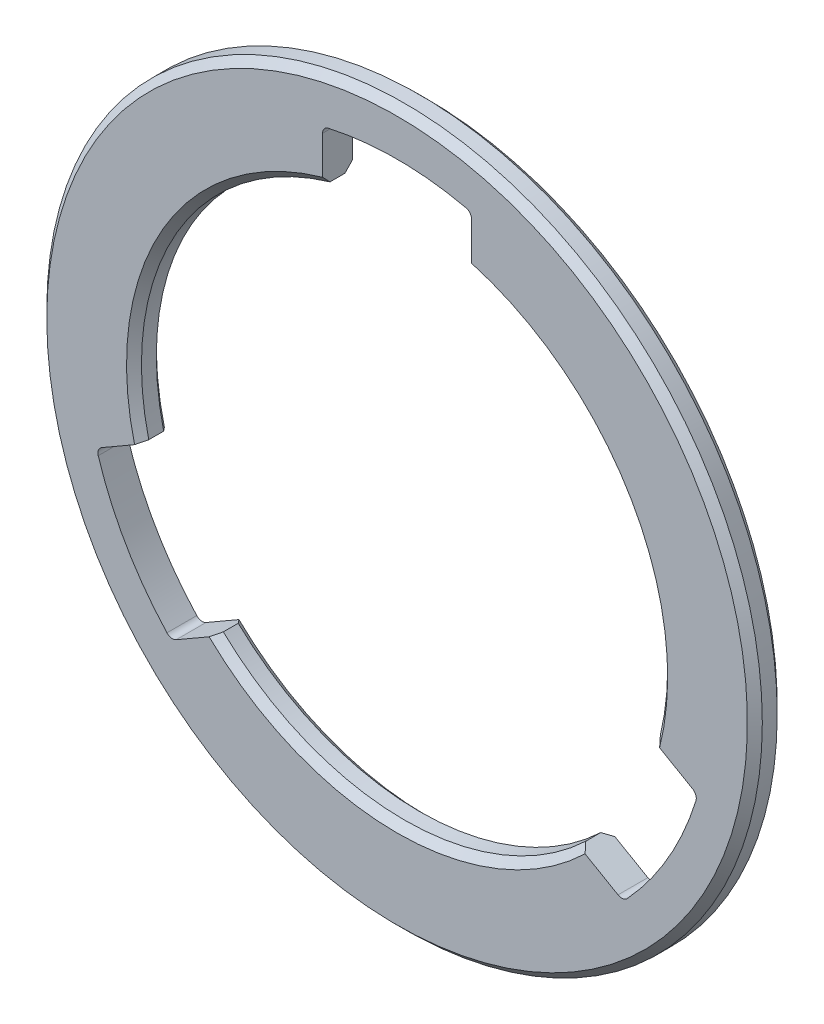
ISO-10303-21;
HEADER;
FILE_DESCRIPTION(('STEP AP214'),'2;1');
FILE_NAME('part.step','',(''),(''),'','','');
FILE_SCHEMA(('AUTOMOTIVE_DESIGN { 1 0 10303 214 1 1 1 1 }'));
ENDSEC;
DATA;
#1=APPLICATION_CONTEXT('core data for automotive mechanical design processes');
#2=APPLICATION_PROTOCOL_DEFINITION('international standard','automotive_design',2000,#1);
#3=PRODUCT_CONTEXT('',#1,'mechanical');
#4=PRODUCT('Part','Part','',(#3));
#5=PRODUCT_RELATED_PRODUCT_CATEGORY('part','',(#4));
#6=PRODUCT_DEFINITION_FORMATION('','',#4);
#7=PRODUCT_DEFINITION_CONTEXT('part definition',#1,'design');
#8=PRODUCT_DEFINITION('design','',#6,#7);
#9=PRODUCT_DEFINITION_SHAPE('','',#8);
#10=(LENGTH_UNIT() NAMED_UNIT(*) SI_UNIT(.MILLI.,.METRE.));
#11=(NAMED_UNIT(*) PLANE_ANGLE_UNIT() SI_UNIT($,.RADIAN.));
#12=(NAMED_UNIT(*) SI_UNIT($,.STERADIAN.) SOLID_ANGLE_UNIT());
#13=UNCERTAINTY_MEASURE_WITH_UNIT(LENGTH_MEASURE(1.E-05),#10,'distance_accuracy_value','');
#14=(GEOMETRIC_REPRESENTATION_CONTEXT(3) GLOBAL_UNCERTAINTY_ASSIGNED_CONTEXT((#13)) GLOBAL_UNIT_ASSIGNED_CONTEXT((#10,
#11,#12)) REPRESENTATION_CONTEXT('',''));
#15=CARTESIAN_POINT('',(0.,0.,0.));
#16=DIRECTION('',(0.,0.,1.));
#17=DIRECTION('',(1.,0.,0.));
#18=AXIS2_PLACEMENT_3D('',#15,#16,#17);
#19=CARTESIAN_POINT('',(0.,0.,2.));
#20=DIRECTION('',(0.,0.,-1.));
#21=DIRECTION('',(-1.,0.,0.));
#22=AXIS2_PLACEMENT_3D('',#19,#20,#21);
#23=CYLINDRICAL_SURFACE('',#22,17.65);
#24=CARTESIAN_POINT('',(0.,0.,1.5));
#25=DIRECTION('',(0.,0.,-1.));
#26=DIRECTION('',(-1.,0.,0.));
#27=AXIS2_PLACEMENT_3D('',#24,#25,#26);
#28=CIRCLE('',#27,17.65);
#29=CARTESIAN_POINT('',(-12.1591908030424,-12.7936147751606,1.5));
#30=VERTEX_POINT('',#29);
#31=CARTESIAN_POINT('',(12.1591908030423,-12.7936147751608,1.5));
#32=VERTEX_POINT('',#31);
#33=EDGE_CURVE('E283',#30,#32,#28,.F.);
#34=ORIENTED_EDGE('',*,*,#33,.T.);
#35=DIRECTION('',(0.,0.,-1.));
#36=VECTOR('',#35,1.);
#37=CARTESIAN_POINT('',(12.1591908030423,-12.7936147751608,2.));
#38=LINE('',#37,#36);
#39=CARTESIAN_POINT('',(12.1591908030423,-12.7936147751608,0.49999999999999));
#40=VERTEX_POINT('',#39);
#41=EDGE_CURVE('E487',#32,#40,#38,.T.);
#42=ORIENTED_EDGE('',*,*,#41,.T.);
#43=CARTESIAN_POINT('',(0.,0.,0.499999999999994));
#44=DIRECTION('',(0.,0.,-1.));
#45=DIRECTION('',(-1.,0.,0.));
#46=AXIS2_PLACEMENT_3D('',#43,#44,#45);
#47=CIRCLE('',#46,17.65);
#48=CARTESIAN_POINT('',(-12.1591908030424,-12.7936147751606,0.499999999999994));
#49=VERTEX_POINT('',#48);
#50=EDGE_CURVE('E293',#40,#49,#47,.T.);
#51=ORIENTED_EDGE('',*,*,#50,.T.);
#52=DIRECTION('',(0.,0.,-1.));
#53=VECTOR('',#52,1.);
#54=CARTESIAN_POINT('',(-12.1591908030424,-12.7936147751606,2.));
#55=LINE('',#54,#53);
#56=EDGE_CURVE('E241',#30,#49,#55,.T.);
#57=ORIENTED_EDGE('',*,*,#56,.F.);
#58=EDGE_LOOP('',(#34,#42,#51,#57));
#59=FACE_BOUND('',#58,.T.);
#60=ADVANCED_FACE('F50',(#59),#23,.F.);
#61=CARTESIAN_POINT('',(-5.,16.9269755124771,1.5));
#62=VERTEX_POINT('',#61);
#63=CARTESIAN_POINT('',(-17.1591908030423,-4.13336073731621,1.5));
#64=VERTEX_POINT('',#63);
#65=EDGE_CURVE('E285',#62,#64,#28,.F.);
#66=ORIENTED_EDGE('',*,*,#65,.T.);
#67=DIRECTION('',(0.,0.,-1.));
#68=VECTOR('',#67,1.);
#69=CARTESIAN_POINT('',(-17.1591908030423,-4.13336073731621,2.));
#70=LINE('',#69,#68);
#71=CARTESIAN_POINT('',(-17.1591908030423,-4.13336073731621,0.499999999999994));
#72=VERTEX_POINT('',#71);
#73=EDGE_CURVE('E248',#64,#72,#70,.T.);
#74=ORIENTED_EDGE('',*,*,#73,.T.);
#75=CARTESIAN_POINT('',(-5.,16.9269755124771,0.499999999999992));
#76=VERTEX_POINT('',#75);
#77=EDGE_CURVE('E288',#72,#76,#47,.T.);
#78=ORIENTED_EDGE('',*,*,#77,.T.);
#79=DIRECTION('',(0.,0.,-1.));
#80=VECTOR('',#79,1.);
#81=CARTESIAN_POINT('',(-5.,16.9269755124771,2.));
#82=LINE('',#81,#80);
#83=EDGE_CURVE('E335',#62,#76,#82,.T.);
#84=ORIENTED_EDGE('',*,*,#83,.F.);
#85=EDGE_LOOP('',(#66,#74,#78,#84));
#86=FACE_BOUND('',#85,.T.);
#87=ADVANCED_FACE('F434',(#86),#23,.F.);
#88=CARTESIAN_POINT('',(0.,0.,0.499999999999994));
#89=DIRECTION('',(0.,0.,-1.));
#90=DIRECTION('',(-1.,0.,0.));
#91=AXIS2_PLACEMENT_3D('',#88,#89,#90);
#92=CONICAL_SURFACE('',#91,17.65,0.785398163397448);
#93=CARTESIAN_POINT('',(12.6103381838395,-13.0540848369083,-0.000199999999999527));
#94=CARTESIAN_POINT('',(12.5351595462808,-13.0106804302765,0.0832513416940281));
#95=CARTESIAN_POINT('',(12.4599595621884,-12.9672636992177,0.166677012490159));
#96=CARTESIAN_POINT('',(12.3095169007529,-12.8804055881403,0.333477012490282));
#97=CARTESIAN_POINT('',(12.2342742234095,-12.8369642081215,0.416851341694148));
#98=CARTESIAN_POINT('',(12.1590101995325,-12.7935105036759,0.500199999999993));
#99=B_SPLINE_CURVE_WITH_KNOTS('',3,(#93,#94,#95,#96,#97,#98),.UNSPECIFIED.,.F.,.F.,(4,2,4),(0.,
0.361246500633454,0.722493002149039),.UNSPECIFIED.);
#100=CARTESIAN_POINT('',(12.6101580071155,-13.0539808118282,0.));
#101=VERTEX_POINT('',#100);
#102=EDGE_CURVE('E383',#101,#40,#99,.T.);
#103=ORIENTED_EDGE('',*,*,#102,.F.);
#104=CARTESIAN_POINT('',(0.,0.,0.));
#105=DIRECTION('',(0.,0.,-1.));
#106=DIRECTION('',(-1.,0.,0.));
#107=AXIS2_PLACEMENT_3D('',#104,#105,#106);
#108=CIRCLE('',#107,18.15);
#109=CARTESIAN_POINT('',(-12.6101580071157,-13.0539808118281,0.));
#110=VERTEX_POINT('',#109);
#111=EDGE_CURVE('E511',#110,#101,#108,.F.);
#112=ORIENTED_EDGE('',*,*,#111,.F.);
#113=CARTESIAN_POINT('',(-12.1590101995327,-12.7935105036757,0.500199999999992));
#114=CARTESIAN_POINT('',(-12.2342742234097,-12.8369642081214,0.416851341694149));
#115=CARTESIAN_POINT('',(-12.309516900753,-12.8804055881401,0.333477012490283));
#116=CARTESIAN_POINT('',(-12.4599595621886,-12.9672636992175,0.16667701249016));
#117=CARTESIAN_POINT('',(-12.5351595462809,-13.0106804302763,0.0832513416940287));
#118=CARTESIAN_POINT('',(-12.6103381838397,-13.0540848369081,-0.000199999999999895));
#119=B_SPLINE_CURVE_WITH_KNOTS('',3,(#113,#114,#115,#116,#117,#118),.UNSPECIFIED.,.F.,.F.,(4,2,
4),(0.,0.361246501515584,0.722493002149039),.UNSPECIFIED.);
#120=EDGE_CURVE('E362',#49,#110,#119,.T.);
#121=ORIENTED_EDGE('',*,*,#120,.F.);
#122=ORIENTED_EDGE('',*,*,#50,.F.);
#123=EDGE_LOOP('',(#103,#112,#121,#122));
#124=FACE_BOUND('',#123,.T.);
#125=ADVANCED_FACE('F352',(#124),#92,.F.);
#126=CARTESIAN_POINT('',(-17.6103381838396,-4.3938307990637,-0.000199999999999402));
#127=CARTESIAN_POINT('',(-17.5351595462809,-4.35042639243185,0.0832513416940282));
#128=CARTESIAN_POINT('',(-17.4599595621885,-4.30700966137309,0.166677012490159));
#129=CARTESIAN_POINT('',(-17.309516900753,-4.22015155029567,0.33347701249028));
#130=CARTESIAN_POINT('',(-17.2342742234096,-4.17671017027695,0.416851341694146));
#131=CARTESIAN_POINT('',(-17.1590101995326,-4.13325646583125,0.500199999999989));
#132=B_SPLINE_CURVE_WITH_KNOTS('',3,(#126,#127,#128,#129,#130,#131),.UNSPECIFIED.,.F.,.F.,(4,2,
4),(0.,0.361246500633452,0.722493002149036),.UNSPECIFIED.);
#133=CARTESIAN_POINT('',(-17.6101580071157,-4.39372677398362,0.));
#134=VERTEX_POINT('',#133);
#135=EDGE_CURVE('E370',#134,#72,#132,.T.);
#136=ORIENTED_EDGE('',*,*,#135,.F.);
#137=CARTESIAN_POINT('',(-5.,17.447707585812,0.));
#138=VERTEX_POINT('',#137);
#139=EDGE_CURVE('E529',#138,#134,#108,.F.);
#140=ORIENTED_EDGE('',*,*,#139,.F.);
#141=CARTESIAN_POINT('',(-5.,15.6054924629073,1.7630724353265));
#142=CARTESIAN_POINT('',(-5.,15.8742778879233,1.50709957923826));
#143=CARTESIAN_POINT('',(-5.,16.1427605947125,1.25080919893928));
#144=CARTESIAN_POINT('',(-5.,16.679190211907,0.737670071878489));
#145=CARTESIAN_POINT('',(-5.,16.9471371241062,0.480821326992185));
#146=CARTESIAN_POINT('',(-5.,17.4825663802371,-0.0333593598425538));
#147=CARTESIAN_POINT('',(-5.,17.7500487245398,-0.290691301404765));
#148=CARTESIAN_POINT('',(-5.,18.2846040684708,-0.805781819875646));
#149=CARTESIAN_POINT('',(-5.,18.551677066725,-1.06354039821038));
#150=CARTESIAN_POINT('',(-5.,18.8185720008104,-1.32148304956984));
#151=B_SPLINE_CURVE_WITH_KNOTS('',3,(#141,#142,#143,#144,#145,#146,#147,#148,#149,#150),
.UNSPECIFIED.,.F.,.F.,(4,2,2,2,4),(0.,1.11351157498704,2.22701941551088,3.34052636637302,
4.45403704676666),.UNSPECIFIED.);
#152=EDGE_CURVE('E325',#76,#138,#151,.T.);
#153=ORIENTED_EDGE('',*,*,#152,.F.);
#154=ORIENTED_EDGE('',*,*,#77,.F.);
#155=EDGE_LOOP('',(#136,#140,#153,#154));
#156=FACE_BOUND('',#155,.T.);
#157=ADVANCED_FACE('F353',(#156),#92,.F.);
#158=CARTESIAN_POINT('',(0.,0.,2.));
#159=DIRECTION('',(0.,0.,1.));
#160=DIRECTION('',(1.,0.,0.));
#161=AXIS2_PLACEMENT_3D('',#158,#159,#160);
#162=CONICAL_SURFACE('',#161,18.15,0.785398163397445);
#163=CARTESIAN_POINT('',(12.1590101995325,-12.7935105036759,1.4998));
#164=CARTESIAN_POINT('',(12.2342742234095,-12.8369642081215,1.58314865830584));
#165=CARTESIAN_POINT('',(12.3095169007529,-12.8804055881403,1.66652298750971));
#166=CARTESIAN_POINT('',(12.4599595621884,-12.9672636992177,1.83332298750984));
#167=CARTESIAN_POINT('',(12.5351595462808,-13.0106804302765,1.91674865830597));
#168=CARTESIAN_POINT('',(12.6103381838395,-13.0540848369083,2.0002));
#169=B_SPLINE_CURVE_WITH_KNOTS('',3,(#163,#164,#165,#166,#167,#168),.UNSPECIFIED.,.F.,.F.,(4,2,
4),(0.,0.361246501515592,0.722493002149054),.UNSPECIFIED.);
#170=CARTESIAN_POINT('',(12.6101580071156,-13.0539808118282,2.));
#171=VERTEX_POINT('',#170);
#172=EDGE_CURVE('E406',#32,#171,#169,.T.);
#173=ORIENTED_EDGE('',*,*,#172,.F.);
#174=ORIENTED_EDGE('',*,*,#33,.F.);
#175=CARTESIAN_POINT('',(-12.6103381838397,-13.0540848369081,2.0002));
#176=CARTESIAN_POINT('',(-12.535159546281,-13.0106804302763,1.91674865830597));
#177=CARTESIAN_POINT('',(-12.4599595621886,-12.9672636992175,1.83332298750984));
#178=CARTESIAN_POINT('',(-12.3095169007531,-12.8804055881401,1.66652298750971));
#179=CARTESIAN_POINT('',(-12.2342742234097,-12.8369642081214,1.58314865830584));
#180=CARTESIAN_POINT('',(-12.1590101995327,-12.7935105036757,1.4998));
#181=B_SPLINE_CURVE_WITH_KNOTS('',3,(#175,#176,#177,#178,#179,#180),.UNSPECIFIED.,.F.,.F.,(4,2,
4),(0.,0.36124650063346,0.722493002149052),.UNSPECIFIED.);
#182=CARTESIAN_POINT('',(-12.6101580071157,-13.0539808118281,2.));
#183=VERTEX_POINT('',#182);
#184=EDGE_CURVE('E253',#183,#30,#181,.T.);
#185=ORIENTED_EDGE('',*,*,#184,.F.);
#186=CARTESIAN_POINT('',(0.,0.,2.));
#187=DIRECTION('',(0.,0.,-1.));
#188=DIRECTION('',(-1.,0.,0.));
#189=AXIS2_PLACEMENT_3D('',#186,#187,#188);
#190=CIRCLE('',#189,18.15);
#191=EDGE_CURVE('E259',#171,#183,#190,.T.);
#192=ORIENTED_EDGE('',*,*,#191,.F.);
#193=EDGE_LOOP('',(#173,#174,#185,#192));
#194=FACE_BOUND('',#193,.T.);
#195=ADVANCED_FACE('F597',(#194),#162,.F.);
#196=CARTESIAN_POINT('',(-17.1590101995326,-4.13325646583125,1.49979999999999));
#197=CARTESIAN_POINT('',(-17.2342742234096,-4.17671017027695,1.58314865830584));
#198=CARTESIAN_POINT('',(-17.309516900753,-4.22015155029566,1.66652298750971));
#199=CARTESIAN_POINT('',(-17.4599595621885,-4.30700966137309,1.83332298750984));
#200=CARTESIAN_POINT('',(-17.5351595462809,-4.35042639243186,1.91674865830597));
#201=CARTESIAN_POINT('',(-17.6103381838396,-4.3938307990637,2.0002));
#202=B_SPLINE_CURVE_WITH_KNOTS('',3,(#196,#197,#198,#199,#200,#201),.UNSPECIFIED.,.F.,.F.,(4,2,
4),(0.,0.361246501515594,0.722493002149056),.UNSPECIFIED.);
#203=CARTESIAN_POINT('',(-17.6101580071157,-4.39372677398362,2.));
#204=VERTEX_POINT('',#203);
#205=EDGE_CURVE('E245',#64,#204,#202,.T.);
#206=ORIENTED_EDGE('',*,*,#205,.F.);
#207=ORIENTED_EDGE('',*,*,#65,.F.);
#208=CARTESIAN_POINT('',(-5.,18.8185720008104,3.32148304956985));
#209=CARTESIAN_POINT('',(-5.,18.551677066725,3.06354039821039));
#210=CARTESIAN_POINT('',(-5.,18.2846040684708,2.80578181987565));
#211=CARTESIAN_POINT('',(-5.,17.7500487245398,2.29069130140476));
#212=CARTESIAN_POINT('',(-5.,17.4825663802371,2.03335935984255));
#213=CARTESIAN_POINT('',(-5.,16.9471371241062,1.5191786730078));
#214=CARTESIAN_POINT('',(-5.,16.679190211907,1.26232992812149));
#215=CARTESIAN_POINT('',(-5.,16.1427605947125,0.749190801060692));
#216=CARTESIAN_POINT('',(-5.,15.8742778879232,0.492900420761712));
#217=CARTESIAN_POINT('',(-5.,15.6054924629073,0.236927564673468));
#218=B_SPLINE_CURVE_WITH_KNOTS('',3,(#208,#209,#210,#211,#212,#213,#214,#215,#216,#217),
.UNSPECIFIED.,.F.,.F.,(4,2,2,2,4),(0.,1.11351068039365,2.22701763125581,3.34052547177965,
4.4540370467667),.UNSPECIFIED.);
#219=CARTESIAN_POINT('',(-5.,17.447707585812,2.));
#220=VERTEX_POINT('',#219);
#221=EDGE_CURVE('E257',#220,#62,#218,.T.);
#222=ORIENTED_EDGE('',*,*,#221,.F.);
#223=EDGE_CURVE('E233',#204,#220,#190,.T.);
#224=ORIENTED_EDGE('',*,*,#223,.F.);
#225=EDGE_LOOP('',(#206,#207,#222,#224));
#226=FACE_BOUND('',#225,.T.);
#227=ADVANCED_FACE('F256',(#226),#162,.F.);
#228=CARTESIAN_POINT('',(0.,0.,2.));
#229=DIRECTION('',(0.,0.,-1.));
#230=DIRECTION('',(-1.,0.,0.));
#231=AXIS2_PLACEMENT_3D('',#228,#229,#230);
#232=CYLINDRICAL_SURFACE('',#231,24.);
#233=CARTESIAN_POINT('',(0.,0.,0.500000000000014));
#234=DIRECTION('',(0.,0.,-1.));
#235=DIRECTION('',(-1.,0.,0.));
#236=AXIS2_PLACEMENT_3D('',#233,#234,#235);
#237=CIRCLE('',#236,24.);
#238=CARTESIAN_POINT('',(-24.,0.,0.500000000000014));
#239=VERTEX_POINT('',#238);
#240=EDGE_CURVE('E260',#239,#239,#237,.F.);
#241=ORIENTED_EDGE('',*,*,#240,.T.);
#242=EDGE_LOOP('',(#241));
#243=FACE_BOUND('',#242,.T.);
#244=CARTESIAN_POINT('',(0.,0.,1.5));
#245=DIRECTION('',(0.,0.,-1.));
#246=DIRECTION('',(-1.,0.,0.));
#247=AXIS2_PLACEMENT_3D('',#244,#245,#246);
#248=CIRCLE('',#247,24.);
#249=CARTESIAN_POINT('',(-24.,0.,1.5));
#250=VERTEX_POINT('',#249);
#251=EDGE_CURVE('E268',#250,#250,#248,.T.);
#252=ORIENTED_EDGE('',*,*,#251,.T.);
#253=EDGE_LOOP('',(#252));
#254=FACE_BOUND('',#253,.T.);
#255=ADVANCED_FACE('F605',(#243,#254),#232,.T.);
#256=CARTESIAN_POINT('',(0.,0.,2.));
#257=DIRECTION('',(0.,0.,-1.));
#258=DIRECTION('',(-1.,0.,0.));
#259=AXIS2_PLACEMENT_3D('',#256,#257,#258);
#260=PLANE('',#259);
#261=CARTESIAN_POINT('',(0.,0.,2.));
#262=DIRECTION('',(0.,0.,-1.));
#263=DIRECTION('',(-1.,0.,0.));
#264=AXIS2_PLACEMENT_3D('',#261,#262,#263);
#265=CIRCLE('',#264,23.5);
#266=CARTESIAN_POINT('',(-23.5,0.,2.));
#267=VERTEX_POINT('',#266);
#268=EDGE_CURVE('E273',#267,#267,#265,.F.);
#269=ORIENTED_EDGE('',*,*,#268,.T.);
#270=EDGE_LOOP('',(#269));
#271=FACE_BOUND('',#270,.T.);
#272=DIRECTION('',(0.866025403784437,-0.500000000000003,0.));
#273=VECTOR('',#272,1.);
#274=CARTESIAN_POINT('',(20.1635217326557,-5.86791200826347,2.));
#275=LINE('',#274,#273);
#276=CARTESIAN_POINT('',(17.6101580071156,-4.39372677398387,2.));
#277=VERTEX_POINT('',#276);
#278=CARTESIAN_POINT('',(19.8205080756887,-5.6698729810779,2.));
#279=VERTEX_POINT('',#278);
#280=EDGE_CURVE('E486',#277,#279,#275,.T.);
#281=ORIENTED_EDGE('',*,*,#280,.T.);
#282=CARTESIAN_POINT('',(19.5705080756887,-6.10288568297011,2.));
#283=DIRECTION('',(0.,0.,-1.));
#284=DIRECTION('',(-1.,0.,0.));
#285=AXIS2_PLACEMENT_3D('',#282,#283,#284);
#286=CIRCLE('',#285,0.5);
#287=CARTESIAN_POINT('',(20.0478375409494,-6.25173655328646,2.));
#288=VERTEX_POINT('',#287);
#289=EDGE_CURVE('E813',#279,#288,#286,.T.);
#290=ORIENTED_EDGE('',*,*,#289,.T.);
#291=CARTESIAN_POINT('',(0.,0.,2.));
#292=DIRECTION('',(0.,0.,-1.));
#293=DIRECTION('',(0.500000000000004,0.866025403784436,0.));
#294=AXIS2_PLACEMENT_3D('',#291,#292,#293);
#295=CIRCLE('',#294,21.);
#296=CARTESIAN_POINT('',(15.4380814433884,-14.2360683247625,2.));
#297=VERTEX_POINT('',#296);
#298=EDGE_CURVE('E833',#288,#297,#295,.T.);
#299=ORIENTED_EDGE('',*,*,#298,.T.);
#300=CARTESIAN_POINT('',(15.0705080756887,-13.89711431703,2.));
#301=DIRECTION('',(0.,0.,-1.));
#302=DIRECTION('',(-1.,0.,0.));
#303=AXIS2_PLACEMENT_3D('',#300,#301,#302);
#304=CIRCLE('',#303,0.5);
#305=CARTESIAN_POINT('',(14.8205080756887,-14.3301270189223,2.));
#306=VERTEX_POINT('',#305);
#307=EDGE_CURVE('E817',#297,#306,#304,.T.);
#308=ORIENTED_EDGE('',*,*,#307,.T.);
#309=DIRECTION('',(-0.866025403784436,0.500000000000005,0.));
#310=VECTOR('',#309,1.);
#311=CARTESIAN_POINT('',(15.1635217326556,-14.5281660461078,2.));
#312=LINE('',#311,#310);
#313=EDGE_CURVE('E482',#306,#171,#312,.T.);
#314=ORIENTED_EDGE('',*,*,#313,.T.);
#315=ORIENTED_EDGE('',*,*,#191,.T.);
#316=DIRECTION('',(-0.866025403784443,-0.499999999999993,0.));
#317=VECTOR('',#316,1.);
#318=CARTESIAN_POINT('',(-15.1635217326558,-14.5281660461076,2.));
#319=LINE('',#318,#317);
#320=CARTESIAN_POINT('',(-14.8205080756889,-14.3301270189221,2.));
#321=VERTEX_POINT('',#320);
#322=EDGE_CURVE('E491',#183,#321,#319,.T.);
#323=ORIENTED_EDGE('',*,*,#322,.T.);
#324=CARTESIAN_POINT('',(-15.0705080756889,-13.8971143170298,2.));
#325=DIRECTION('',(0.,0.,-1.));
#326=DIRECTION('',(-1.,0.,0.));
#327=AXIS2_PLACEMENT_3D('',#324,#325,#326);
#328=CIRCLE('',#327,0.5);
#329=CARTESIAN_POINT('',(-15.4380814433886,-14.2360683247623,2.));
#330=VERTEX_POINT('',#329);
#331=EDGE_CURVE('E13',#321,#330,#328,.T.);
#332=ORIENTED_EDGE('',*,*,#331,.T.);
#333=CARTESIAN_POINT('',(0.,0.,2.));
#334=DIRECTION('',(0.,0.,-1.));
#335=DIRECTION('',(0.499999999999992,-0.866025403784443,0.));
#336=AXIS2_PLACEMENT_3D('',#333,#334,#335);
#337=CIRCLE('',#336,21.);
#338=CARTESIAN_POINT('',(-20.0478375409495,-6.25173655328618,2.));
#339=VERTEX_POINT('',#338);
#340=EDGE_CURVE('E242',#330,#339,#337,.T.);
#341=ORIENTED_EDGE('',*,*,#340,.T.);
#342=CARTESIAN_POINT('',(-19.5705080756888,-6.10288568296984,2.));
#343=DIRECTION('',(0.,0.,-1.));
#344=DIRECTION('',(-1.,0.,0.));
#345=AXIS2_PLACEMENT_3D('',#342,#343,#344);
#346=CIRCLE('',#345,0.5);
#347=CARTESIAN_POINT('',(-19.8205080756888,-5.66987298107762,2.));
#348=VERTEX_POINT('',#347);
#349=EDGE_CURVE('E237',#339,#348,#346,.T.);
#350=ORIENTED_EDGE('',*,*,#349,.T.);
#351=DIRECTION('',(0.866025403784444,0.499999999999991,0.));
#352=VECTOR('',#351,1.);
#353=CARTESIAN_POINT('',(-20.1635217326557,-5.86791200826319,2.));
#354=LINE('',#353,#352);
#355=EDGE_CURVE('E227',#348,#204,#354,.T.);
#356=ORIENTED_EDGE('',*,*,#355,.T.);
#357=ORIENTED_EDGE('',*,*,#223,.T.);
#358=DIRECTION('',(0.,1.,0.));
#359=VECTOR('',#358,1.);
#360=CARTESIAN_POINT('',(-5.,20.3960780543711,2.));
#361=LINE('',#360,#359);
#362=CARTESIAN_POINT('',(-5.,20.,2.));
#363=VERTEX_POINT('',#362);
#364=EDGE_CURVE('E546',#220,#363,#361,.T.);
#365=ORIENTED_EDGE('',*,*,#364,.T.);
#366=CARTESIAN_POINT('',(-4.5,20.,2.));
#367=DIRECTION('',(0.,0.,-1.));
#368=DIRECTION('',(-1.,0.,0.));
#369=AXIS2_PLACEMENT_3D('',#366,#367,#368);
#370=CIRCLE('',#369,0.5);
#371=CARTESIAN_POINT('',(-4.60975609756098,20.4878048780488,2.));
#372=VERTEX_POINT('',#371);
#373=EDGE_CURVE('E561',#363,#372,#370,.T.);
#374=ORIENTED_EDGE('',*,*,#373,.T.);
#375=CARTESIAN_POINT('',(0.,0.,2.));
#376=DIRECTION('',(0.,0.,-1.));
#377=DIRECTION('',(-1.,0.,0.));
#378=AXIS2_PLACEMENT_3D('',#375,#376,#377);
#379=CIRCLE('',#378,21.);
#380=CARTESIAN_POINT('',(4.60975609756098,20.4878048780488,2.));
#381=VERTEX_POINT('',#380);
#382=EDGE_CURVE('E551',#372,#381,#379,.T.);
#383=ORIENTED_EDGE('',*,*,#382,.T.);
#384=CARTESIAN_POINT('',(4.5,20.,2.));
#385=DIRECTION('',(0.,0.,-1.));
#386=DIRECTION('',(-1.,0.,0.));
#387=AXIS2_PLACEMENT_3D('',#384,#385,#386);
#388=CIRCLE('',#387,0.5);
#389=CARTESIAN_POINT('',(5.,20.,2.));
#390=VERTEX_POINT('',#389);
#391=EDGE_CURVE('E566',#381,#390,#388,.T.);
#392=ORIENTED_EDGE('',*,*,#391,.T.);
#393=DIRECTION('',(0.,-1.,0.));
#394=VECTOR('',#393,1.);
#395=CARTESIAN_POINT('',(5.,20.3960780543711,2.));
#396=LINE('',#395,#394);
#397=CARTESIAN_POINT('',(5.,17.447707585812,2.));
#398=VERTEX_POINT('',#397);
#399=EDGE_CURVE('E526',#390,#398,#396,.T.);
#400=ORIENTED_EDGE('',*,*,#399,.T.);
#401=EDGE_CURVE('E262',#398,#277,#190,.T.);
#402=ORIENTED_EDGE('',*,*,#401,.T.);
#403=EDGE_LOOP('',(#281,#290,#299,#308,#314,#315,#323,#332,#341,#350,#356,#357,#365,#374,#383,
#392,#400,#402));
#404=FACE_BOUND('',#403,.T.);
#405=ADVANCED_FACE('F230',(#271,#404),#260,.F.);
#406=CARTESIAN_POINT('',(0.,0.,0.));
#407=DIRECTION('',(0.,0.,-1.));
#408=DIRECTION('',(-1.,0.,0.));
#409=AXIS2_PLACEMENT_3D('',#406,#407,#408);
#410=PLANE('',#409);
#411=DIRECTION('',(-0.866025403784436,0.500000000000005,0.));
#412=VECTOR('',#411,1.);
#413=CARTESIAN_POINT('',(15.1635217326556,-14.5281660461078,0.));
#414=LINE('',#413,#412);
#415=CARTESIAN_POINT('',(14.8205080756887,-14.3301270189223,0.));
#416=VERTEX_POINT('',#415);
#417=EDGE_CURVE('E478',#416,#101,#414,.T.);
#418=ORIENTED_EDGE('',*,*,#417,.F.);
#419=CARTESIAN_POINT('',(15.0705080756887,-13.89711431703,0.));
#420=DIRECTION('',(0.,0.,-1.));
#421=DIRECTION('',(-1.,0.,0.));
#422=AXIS2_PLACEMENT_3D('',#419,#420,#421);
#423=CIRCLE('',#422,0.5);
#424=CARTESIAN_POINT('',(15.4380814433884,-14.2360683247625,0.));
#425=VERTEX_POINT('',#424);
#426=EDGE_CURVE('E819',#416,#425,#423,.F.);
#427=ORIENTED_EDGE('',*,*,#426,.T.);
#428=CARTESIAN_POINT('',(0.,0.,0.));
#429=DIRECTION('',(0.,0.,-1.));
#430=DIRECTION('',(0.500000000000004,0.866025403784436,0.));
#431=AXIS2_PLACEMENT_3D('',#428,#429,#430);
#432=CIRCLE('',#431,21.);
#433=CARTESIAN_POINT('',(20.0478375409494,-6.25173655328646,0.));
#434=VERTEX_POINT('',#433);
#435=EDGE_CURVE('E475',#434,#425,#432,.T.);
#436=ORIENTED_EDGE('',*,*,#435,.F.);
#437=CARTESIAN_POINT('',(19.5705080756887,-6.10288568297011,0.));
#438=DIRECTION('',(0.,0.,-1.));
#439=DIRECTION('',(-1.,0.,0.));
#440=AXIS2_PLACEMENT_3D('',#437,#438,#439);
#441=CIRCLE('',#440,0.5);
#442=CARTESIAN_POINT('',(19.8205080756887,-5.6698729810779,0.));
#443=VERTEX_POINT('',#442);
#444=EDGE_CURVE('E474',#434,#443,#441,.F.);
#445=ORIENTED_EDGE('',*,*,#444,.T.);
#446=DIRECTION('',(0.866025403784437,-0.500000000000003,0.));
#447=VECTOR('',#446,1.);
#448=CARTESIAN_POINT('',(20.1635217326557,-5.86791200826347,0.));
#449=LINE('',#448,#447);
#450=CARTESIAN_POINT('',(17.6101580071156,-4.39372677398387,0.));
#451=VERTEX_POINT('',#450);
#452=EDGE_CURVE('E467',#451,#443,#449,.T.);
#453=ORIENTED_EDGE('',*,*,#452,.F.);
#454=CARTESIAN_POINT('',(5.,17.447707585812,0.));
#455=VERTEX_POINT('',#454);
#456=EDGE_CURVE('E464',#451,#455,#108,.F.);
#457=ORIENTED_EDGE('',*,*,#456,.T.);
#458=DIRECTION('',(0.,-1.,0.));
#459=VECTOR('',#458,1.);
#460=CARTESIAN_POINT('',(5.,20.3960780543711,0.));
#461=LINE('',#460,#459);
#462=CARTESIAN_POINT('',(5.,20.,0.));
#463=VERTEX_POINT('',#462);
#464=EDGE_CURVE('E543',#463,#455,#461,.T.);
#465=ORIENTED_EDGE('',*,*,#464,.F.);
#466=CARTESIAN_POINT('',(4.5,20.,0.));
#467=DIRECTION('',(0.,0.,-1.));
#468=DIRECTION('',(-1.,0.,0.));
#469=AXIS2_PLACEMENT_3D('',#466,#467,#468);
#470=CIRCLE('',#469,0.5);
#471=CARTESIAN_POINT('',(4.60975609756098,20.4878048780488,0.));
#472=VERTEX_POINT('',#471);
#473=EDGE_CURVE('E574',#463,#472,#470,.F.);
#474=ORIENTED_EDGE('',*,*,#473,.T.);
#475=CARTESIAN_POINT('',(0.,0.,0.));
#476=DIRECTION('',(0.,0.,-1.));
#477=DIRECTION('',(-1.,0.,0.));
#478=AXIS2_PLACEMENT_3D('',#475,#476,#477);
#479=CIRCLE('',#478,21.);
#480=CARTESIAN_POINT('',(-4.60975609756098,20.4878048780488,0.));
#481=VERTEX_POINT('',#480);
#482=EDGE_CURVE('E547',#481,#472,#479,.T.);
#483=ORIENTED_EDGE('',*,*,#482,.F.);
#484=CARTESIAN_POINT('',(-4.5,20.,0.));
#485=DIRECTION('',(0.,0.,-1.));
#486=DIRECTION('',(-1.,0.,0.));
#487=AXIS2_PLACEMENT_3D('',#484,#485,#486);
#488=CIRCLE('',#487,0.5);
#489=CARTESIAN_POINT('',(-5.,20.,0.));
#490=VERTEX_POINT('',#489);
#491=EDGE_CURVE('E562',#481,#490,#488,.F.);
#492=ORIENTED_EDGE('',*,*,#491,.T.);
#493=DIRECTION('',(0.,1.,0.));
#494=VECTOR('',#493,1.);
#495=CARTESIAN_POINT('',(-5.,20.3960780543711,0.));
#496=LINE('',#495,#494);
#497=EDGE_CURVE('E554',#138,#490,#496,.T.);
#498=ORIENTED_EDGE('',*,*,#497,.F.);
#499=ORIENTED_EDGE('',*,*,#139,.T.);
#500=DIRECTION('',(0.866025403784444,0.499999999999991,0.));
#501=VECTOR('',#500,1.);
#502=CARTESIAN_POINT('',(-20.1635217326557,-5.86791200826319,0.));
#503=LINE('',#502,#501);
#504=CARTESIAN_POINT('',(-19.8205080756888,-5.66987298107762,0.));
#505=VERTEX_POINT('',#504);
#506=EDGE_CURVE('E493',#505,#134,#503,.T.);
#507=ORIENTED_EDGE('',*,*,#506,.F.);
#508=CARTESIAN_POINT('',(-19.5705080756888,-6.10288568296984,0.));
#509=DIRECTION('',(0.,0.,-1.));
#510=DIRECTION('',(-1.,0.,0.));
#511=AXIS2_PLACEMENT_3D('',#508,#509,#510);
#512=CIRCLE('',#511,0.5);
#513=CARTESIAN_POINT('',(-20.0478375409495,-6.25173655328618,0.));
#514=VERTEX_POINT('',#513);
#515=EDGE_CURVE('E805',#505,#514,#512,.F.);
#516=ORIENTED_EDGE('',*,*,#515,.T.);
#517=CARTESIAN_POINT('',(0.,0.,0.));
#518=DIRECTION('',(0.,0.,-1.));
#519=DIRECTION('',(0.499999999999992,-0.866025403784443,0.));
#520=AXIS2_PLACEMENT_3D('',#517,#518,#519);
#521=CIRCLE('',#520,21.);
#522=CARTESIAN_POINT('',(-15.4380814433886,-14.2360683247623,0.));
#523=VERTEX_POINT('',#522);
#524=EDGE_CURVE('E497',#523,#514,#521,.T.);
#525=ORIENTED_EDGE('',*,*,#524,.F.);
#526=CARTESIAN_POINT('',(-15.0705080756889,-13.8971143170298,0.));
#527=DIRECTION('',(0.,0.,-1.));
#528=DIRECTION('',(-1.,0.,0.));
#529=AXIS2_PLACEMENT_3D('',#526,#527,#528);
#530=CIRCLE('',#529,0.5);
#531=CARTESIAN_POINT('',(-14.8205080756889,-14.3301270189221,0.));
#532=VERTEX_POINT('',#531);
#533=EDGE_CURVE('E58',#523,#532,#530,.F.);
#534=ORIENTED_EDGE('',*,*,#533,.T.);
#535=DIRECTION('',(-0.866025403784443,-0.499999999999993,0.));
#536=VECTOR('',#535,1.);
#537=CARTESIAN_POINT('',(-15.1635217326558,-14.5281660461076,0.));
#538=LINE('',#537,#536);
#539=EDGE_CURVE('E495',#110,#532,#538,.T.);
#540=ORIENTED_EDGE('',*,*,#539,.F.);
#541=ORIENTED_EDGE('',*,*,#111,.T.);
#542=EDGE_LOOP('',(#418,#427,#436,#445,#453,#457,#465,#474,#483,#492,#498,#499,#507,#516,#525,
#534,#540,#541));
#543=FACE_BOUND('',#542,.T.);
#544=CARTESIAN_POINT('',(0.,0.,0.));
#545=DIRECTION('',(0.,0.,-1.));
#546=DIRECTION('',(-1.,0.,0.));
#547=AXIS2_PLACEMENT_3D('',#544,#545,#546);
#548=CIRCLE('',#547,23.5);
#549=CARTESIAN_POINT('',(-23.5,0.,0.));
#550=VERTEX_POINT('',#549);
#551=EDGE_CURVE('E531',#550,#550,#548,.T.);
#552=ORIENTED_EDGE('',*,*,#551,.T.);
#553=EDGE_LOOP('',(#552));
#554=FACE_BOUND('',#553,.T.);
#555=ADVANCED_FACE('F447',(#543,#554),#410,.T.);
#556=CARTESIAN_POINT('',(5.,16.9269755124771,0.499999999999992));
#557=VERTEX_POINT('',#556);
#558=CARTESIAN_POINT('',(17.1591908030423,-4.13336073731645,0.49999999999999));
#559=VERTEX_POINT('',#558);
#560=EDGE_CURVE('E289',#557,#559,#47,.T.);
#561=ORIENTED_EDGE('',*,*,#560,.T.);
#562=DIRECTION('',(0.,0.,-1.));
#563=VECTOR('',#562,1.);
#564=CARTESIAN_POINT('',(17.1591908030423,-4.13336073731645,2.));
#565=LINE('',#564,#563);
#566=CARTESIAN_POINT('',(17.1591908030423,-4.13336073731645,1.5));
#567=VERTEX_POINT('',#566);
#568=EDGE_CURVE('E458',#567,#559,#565,.T.);
#569=ORIENTED_EDGE('',*,*,#568,.F.);
#570=CARTESIAN_POINT('',(5.,16.9269755124771,1.5));
#571=VERTEX_POINT('',#570);
#572=EDGE_CURVE('E279',#567,#571,#28,.F.);
#573=ORIENTED_EDGE('',*,*,#572,.T.);
#574=DIRECTION('',(0.,0.,-1.));
#575=VECTOR('',#574,1.);
#576=CARTESIAN_POINT('',(5.,16.9269755124771,2.));
#577=LINE('',#576,#575);
#578=EDGE_CURVE('E334',#571,#557,#577,.T.);
#579=ORIENTED_EDGE('',*,*,#578,.T.);
#580=EDGE_LOOP('',(#561,#569,#573,#579));
#581=FACE_BOUND('',#580,.T.);
#582=ADVANCED_FACE('F437',(#581),#23,.F.);
#583=CARTESIAN_POINT('',(0.,0.,0.));
#584=DIRECTION('',(0.,0.,1.));
#585=DIRECTION('',(1.,0.,0.));
#586=AXIS2_PLACEMENT_3D('',#583,#584,#585);
#587=CONICAL_SURFACE('',#586,23.5,0.785398163397438);
#588=ORIENTED_EDGE('',*,*,#240,.F.);
#589=EDGE_LOOP('',(#588));
#590=FACE_BOUND('',#589,.T.);
#591=ORIENTED_EDGE('',*,*,#551,.F.);
#592=EDGE_LOOP('',(#591));
#593=FACE_BOUND('',#592,.T.);
#594=ADVANCED_FACE('F446',(#590,#593),#587,.T.);
#595=CARTESIAN_POINT('',(0.,0.,1.5));
#596=DIRECTION('',(0.,0.,-1.));
#597=DIRECTION('',(-1.,0.,0.));
#598=AXIS2_PLACEMENT_3D('',#595,#596,#597);
#599=CONICAL_SURFACE('',#598,24.,0.785398163397448);
#600=ORIENTED_EDGE('',*,*,#268,.F.);
#601=EDGE_LOOP('',(#600));
#602=FACE_BOUND('',#601,.T.);
#603=ORIENTED_EDGE('',*,*,#251,.F.);
#604=EDGE_LOOP('',(#603));
#605=FACE_BOUND('',#604,.T.);
#606=ADVANCED_FACE('F350',(#602,#605),#599,.T.);
#607=CARTESIAN_POINT('',(17.1590101995326,-4.13325646583149,0.500199999999992));
#608=CARTESIAN_POINT('',(17.2342742234096,-4.17671017027719,0.416851341694147));
#609=CARTESIAN_POINT('',(17.3095169007529,-4.2201515502959,0.33347701249028));
#610=CARTESIAN_POINT('',(17.4599595621885,-4.30700966137333,0.166677012490157));
#611=CARTESIAN_POINT('',(17.5351595462808,-4.3504263924321,0.0832513416940256));
#612=CARTESIAN_POINT('',(17.6103381838395,-4.39383079906395,-0.000200000000002298));
#613=B_SPLINE_CURVE_WITH_KNOTS('',3,(#607,#608,#609,#610,#611,#612),.UNSPECIFIED.,.F.,.F.,(4,2,
4),(0.,0.361246501515584,0.722493002149043),.UNSPECIFIED.);
#614=EDGE_CURVE('E377',#559,#451,#613,.T.);
#615=ORIENTED_EDGE('',*,*,#614,.F.);
#616=ORIENTED_EDGE('',*,*,#560,.F.);
#617=CARTESIAN_POINT('',(5.,18.8185720008104,-1.32148304956984));
#618=CARTESIAN_POINT('',(5.,18.551677066725,-1.06354039821038));
#619=CARTESIAN_POINT('',(5.,18.2846040684708,-0.805781819875646));
#620=CARTESIAN_POINT('',(5.,17.7500487245398,-0.290691301404765));
#621=CARTESIAN_POINT('',(5.,17.4825663802371,-0.0333593598425538));
#622=CARTESIAN_POINT('',(5.,16.9471371241062,0.480821326992186));
#623=CARTESIAN_POINT('',(5.,16.679190211907,0.737670071878489));
#624=CARTESIAN_POINT('',(5.,16.1427605947125,1.25080919893928));
#625=CARTESIAN_POINT('',(5.,15.8742778879233,1.50709957923826));
#626=CARTESIAN_POINT('',(5.,15.6054924629073,1.7630724353265));
#627=B_SPLINE_CURVE_WITH_KNOTS('',3,(#617,#618,#619,#620,#621,#622,#623,#624,#625,#626),
.UNSPECIFIED.,.F.,.F.,(4,2,2,2,4),(0.,1.11351068039364,2.22701763125579,3.34052547177962,
4.45403704676666),.UNSPECIFIED.);
#628=EDGE_CURVE('E333',#455,#557,#627,.T.);
#629=ORIENTED_EDGE('',*,*,#628,.F.);
#630=ORIENTED_EDGE('',*,*,#456,.F.);
#631=EDGE_LOOP('',(#615,#616,#629,#630));
#632=FACE_BOUND('',#631,.T.);
#633=ADVANCED_FACE('F343',(#632),#92,.F.);
#634=CARTESIAN_POINT('',(17.6103381838396,-4.39383079906395,2.0002));
#635=CARTESIAN_POINT('',(17.5351595462808,-4.3504263924321,1.91674865830597));
#636=CARTESIAN_POINT('',(17.4599595621885,-4.30700966137333,1.83332298750984));
#637=CARTESIAN_POINT('',(17.3095169007529,-4.22015155029591,1.66652298750971));
#638=CARTESIAN_POINT('',(17.2342742234096,-4.17671017027719,1.58314865830584));
#639=CARTESIAN_POINT('',(17.1590101995326,-4.13325646583149,1.4998));
#640=B_SPLINE_CURVE_WITH_KNOTS('',3,(#634,#635,#636,#637,#638,#639),.UNSPECIFIED.,.F.,.F.,(4,2,
4),(0.,0.361246500633462,0.722493002149054),.UNSPECIFIED.);
#641=EDGE_CURVE('E252',#277,#567,#640,.T.);
#642=ORIENTED_EDGE('',*,*,#641,.F.);
#643=ORIENTED_EDGE('',*,*,#401,.F.);
#644=CARTESIAN_POINT('',(5.,15.6054924629073,0.236927564673469));
#645=CARTESIAN_POINT('',(5.,15.8742778879232,0.492900420761713));
#646=CARTESIAN_POINT('',(5.,16.1427605947125,0.749190801060692));
#647=CARTESIAN_POINT('',(5.,16.679190211907,1.26232992812149));
#648=CARTESIAN_POINT('',(5.,16.9471371241062,1.5191786730078));
#649=CARTESIAN_POINT('',(5.,17.4825663802371,2.03335935984255));
#650=CARTESIAN_POINT('',(5.,17.7500487245398,2.29069130140476));
#651=CARTESIAN_POINT('',(5.,18.2846040684708,2.80578181987565));
#652=CARTESIAN_POINT('',(5.,18.551677066725,3.06354039821039));
#653=CARTESIAN_POINT('',(5.,18.8185720008104,3.32148304956985));
#654=B_SPLINE_CURVE_WITH_KNOTS('',3,(#644,#645,#646,#647,#648,#649,#650,#651,#652,#653),
.UNSPECIFIED.,.F.,.F.,(4,2,2,2,4),(0.,1.11351157498705,2.2270194155109,3.34052636637305,
4.4540370467667),.UNSPECIFIED.);
#655=EDGE_CURVE('E302',#571,#398,#654,.T.);
#656=ORIENTED_EDGE('',*,*,#655,.F.);
#657=ORIENTED_EDGE('',*,*,#572,.F.);
#658=EDGE_LOOP('',(#642,#643,#656,#657));
#659=FACE_BOUND('',#658,.T.);
#660=ADVANCED_FACE('F310',(#659),#162,.F.);
#661=CARTESIAN_POINT('',(5.,20.3960780543711,2.));
#662=DIRECTION('',(1.,0.,0.));
#663=DIRECTION('',(0.,1.,0.));
#664=AXIS2_PLACEMENT_3D('',#661,#662,#663);
#665=PLANE('',#664);
#666=ORIENTED_EDGE('',*,*,#399,.F.);
#667=DIRECTION('',(0.,0.,1.));
#668=VECTOR('',#667,1.);
#669=CARTESIAN_POINT('',(5.,20.,0.));
#670=LINE('',#669,#668);
#671=EDGE_CURVE('E545',#390,#463,#670,.F.);
#672=ORIENTED_EDGE('',*,*,#671,.T.);
#673=ORIENTED_EDGE('',*,*,#464,.T.);
#674=ORIENTED_EDGE('',*,*,#628,.T.);
#675=ORIENTED_EDGE('',*,*,#578,.F.);
#676=ORIENTED_EDGE('',*,*,#655,.T.);
#677=EDGE_LOOP('',(#666,#672,#673,#674,#675,#676));
#678=FACE_BOUND('',#677,.T.);
#679=ADVANCED_FACE('F539',(#678),#665,.F.);
#680=CARTESIAN_POINT('',(0.,0.,2.));
#681=DIRECTION('',(0.,0.,-1.));
#682=DIRECTION('',(-1.,0.,0.));
#683=AXIS2_PLACEMENT_3D('',#680,#681,#682);
#684=CYLINDRICAL_SURFACE('',#683,21.);
#685=ORIENTED_EDGE('',*,*,#482,.T.);
#686=DIRECTION('',(0.,0.,-1.));
#687=VECTOR('',#686,1.);
#688=CARTESIAN_POINT('',(4.60975609756098,20.4878048780488,2.));
#689=LINE('',#688,#687);
#690=EDGE_CURVE('E570',#472,#381,#689,.F.);
#691=ORIENTED_EDGE('',*,*,#690,.T.);
#692=ORIENTED_EDGE('',*,*,#382,.F.);
#693=DIRECTION('',(0.,0.,-1.));
#694=VECTOR('',#693,1.);
#695=CARTESIAN_POINT('',(-4.60975609756098,20.4878048780488,2.));
#696=LINE('',#695,#694);
#697=EDGE_CURVE('E568',#372,#481,#696,.T.);
#698=ORIENTED_EDGE('',*,*,#697,.T.);
#699=EDGE_LOOP('',(#685,#691,#692,#698));
#700=FACE_BOUND('',#699,.T.);
#701=ADVANCED_FACE('F320',(#700),#684,.F.);
#702=CARTESIAN_POINT('',(-5.,20.3960780543711,2.));
#703=DIRECTION('',(-1.,0.,0.));
#704=DIRECTION('',(0.,-1.,0.));
#705=AXIS2_PLACEMENT_3D('',#702,#703,#704);
#706=PLANE('',#705);
#707=ORIENTED_EDGE('',*,*,#497,.T.);
#708=DIRECTION('',(0.,0.,1.));
#709=VECTOR('',#708,1.);
#710=CARTESIAN_POINT('',(-5.,20.,2.));
#711=LINE('',#710,#709);
#712=EDGE_CURVE('E573',#490,#363,#711,.T.);
#713=ORIENTED_EDGE('',*,*,#712,.T.);
#714=ORIENTED_EDGE('',*,*,#364,.F.);
#715=ORIENTED_EDGE('',*,*,#221,.T.);
#716=ORIENTED_EDGE('',*,*,#83,.T.);
#717=ORIENTED_EDGE('',*,*,#152,.T.);
#718=EDGE_LOOP('',(#707,#713,#714,#715,#716,#717));
#719=FACE_BOUND('',#718,.T.);
#720=ADVANCED_FACE('F314',(#719),#706,.F.);
#721=CARTESIAN_POINT('',(4.5,20.,2.));
#722=DIRECTION('',(0.,0.,-1.));
#723=DIRECTION('',(-1.,0.,0.));
#724=AXIS2_PLACEMENT_3D('',#721,#722,#723);
#725=CYLINDRICAL_SURFACE('',#724,0.5);
#726=ORIENTED_EDGE('',*,*,#391,.F.);
#727=ORIENTED_EDGE('',*,*,#690,.F.);
#728=ORIENTED_EDGE('',*,*,#473,.F.);
#729=ORIENTED_EDGE('',*,*,#671,.F.);
#730=EDGE_LOOP('',(#726,#727,#728,#729));
#731=FACE_BOUND('',#730,.T.);
#732=ADVANCED_FACE('F319',(#731),#725,.F.);
#733=CARTESIAN_POINT('',(-4.5,20.,2.));
#734=DIRECTION('',(0.,0.,-1.));
#735=DIRECTION('',(-1.,0.,0.));
#736=AXIS2_PLACEMENT_3D('',#733,#734,#735);
#737=CYLINDRICAL_SURFACE('',#736,0.5);
#738=ORIENTED_EDGE('',*,*,#373,.F.);
#739=ORIENTED_EDGE('',*,*,#712,.F.);
#740=ORIENTED_EDGE('',*,*,#491,.F.);
#741=ORIENTED_EDGE('',*,*,#697,.F.);
#742=EDGE_LOOP('',(#738,#739,#740,#741));
#743=FACE_BOUND('',#742,.T.);
#744=ADVANCED_FACE('F682',(#743),#737,.F.);
#745=CARTESIAN_POINT('',(-20.1635217326557,-5.86791200826319,2.));
#746=DIRECTION('',(-0.499999999999991,0.866025403784444,0.));
#747=DIRECTION('',(-0.866025403784444,-0.499999999999991,0.));
#748=AXIS2_PLACEMENT_3D('',#745,#746,#747);
#749=PLANE('',#748);
#750=ORIENTED_EDGE('',*,*,#355,.F.);
#751=DIRECTION('',(0.,0.,1.));
#752=VECTOR('',#751,1.);
#753=CARTESIAN_POINT('',(-19.8205080756888,-5.66987298107762,0.));
#754=LINE('',#753,#752);
#755=EDGE_CURVE('E807',#348,#505,#754,.F.);
#756=ORIENTED_EDGE('',*,*,#755,.T.);
#757=ORIENTED_EDGE('',*,*,#506,.T.);
#758=ORIENTED_EDGE('',*,*,#135,.T.);
#759=ORIENTED_EDGE('',*,*,#73,.F.);
#760=ORIENTED_EDGE('',*,*,#205,.T.);
#761=EDGE_LOOP('',(#750,#756,#757,#758,#759,#760));
#762=FACE_BOUND('',#761,.T.);
#763=ADVANCED_FACE('F246',(#762),#749,.F.);
#764=CARTESIAN_POINT('',(0.,0.,2.));
#765=DIRECTION('',(0.,0.,-1.));
#766=DIRECTION('',(-1.,0.,0.));
#767=AXIS2_PLACEMENT_3D('',#764,#765,#766);
#768=CYLINDRICAL_SURFACE('',#767,21.);
#769=ORIENTED_EDGE('',*,*,#524,.T.);
#770=DIRECTION('',(0.,0.,-1.));
#771=VECTOR('',#770,1.);
#772=CARTESIAN_POINT('',(-20.0478375409495,-6.25173655328618,2.));
#773=LINE('',#772,#771);
#774=EDGE_CURVE('E803',#514,#339,#773,.F.);
#775=ORIENTED_EDGE('',*,*,#774,.T.);
#776=ORIENTED_EDGE('',*,*,#340,.F.);
#777=DIRECTION('',(0.,0.,-1.));
#778=VECTOR('',#777,1.);
#779=CARTESIAN_POINT('',(-15.4380814433886,-14.2360683247623,2.));
#780=LINE('',#779,#778);
#781=EDGE_CURVE('E800',#330,#523,#780,.T.);
#782=ORIENTED_EDGE('',*,*,#781,.T.);
#783=EDGE_LOOP('',(#769,#775,#776,#782));
#784=FACE_BOUND('',#783,.T.);
#785=ADVANCED_FACE('F431',(#784),#768,.F.);
#786=CARTESIAN_POINT('',(-15.1635217326558,-14.5281660461076,2.));
#787=DIRECTION('',(0.499999999999993,-0.866025403784443,0.));
#788=DIRECTION('',(0.866025403784443,0.499999999999993,0.));
#789=AXIS2_PLACEMENT_3D('',#786,#787,#788);
#790=PLANE('',#789);
#791=ORIENTED_EDGE('',*,*,#539,.T.);
#792=DIRECTION('',(0.,0.,1.));
#793=VECTOR('',#792,1.);
#794=CARTESIAN_POINT('',(-14.8205080756889,-14.3301270189221,2.));
#795=LINE('',#794,#793);
#796=EDGE_CURVE('E65',#532,#321,#795,.T.);
#797=ORIENTED_EDGE('',*,*,#796,.T.);
#798=ORIENTED_EDGE('',*,*,#322,.F.);
#799=ORIENTED_EDGE('',*,*,#184,.T.);
#800=ORIENTED_EDGE('',*,*,#56,.T.);
#801=ORIENTED_EDGE('',*,*,#120,.T.);
#802=EDGE_LOOP('',(#791,#797,#798,#799,#800,#801));
#803=FACE_BOUND('',#802,.T.);
#804=ADVANCED_FACE('F423',(#803),#790,.F.);
#805=CARTESIAN_POINT('',(15.1635217326556,-14.5281660461078,2.));
#806=DIRECTION('',(-0.500000000000005,-0.866025403784436,0.));
#807=DIRECTION('',(0.866025403784436,-0.500000000000005,0.));
#808=AXIS2_PLACEMENT_3D('',#805,#806,#807);
#809=PLANE('',#808);
#810=ORIENTED_EDGE('',*,*,#313,.F.);
#811=DIRECTION('',(0.,0.,1.));
#812=VECTOR('',#811,1.);
#813=CARTESIAN_POINT('',(14.8205080756887,-14.3301270189223,0.));
#814=LINE('',#813,#812);
#815=EDGE_CURVE('E418',#306,#416,#814,.F.);
#816=ORIENTED_EDGE('',*,*,#815,.T.);
#817=ORIENTED_EDGE('',*,*,#417,.T.);
#818=ORIENTED_EDGE('',*,*,#102,.T.);
#819=ORIENTED_EDGE('',*,*,#41,.F.);
#820=ORIENTED_EDGE('',*,*,#172,.T.);
#821=EDGE_LOOP('',(#810,#816,#817,#818,#819,#820));
#822=FACE_BOUND('',#821,.T.);
#823=ADVANCED_FACE('F420',(#822),#809,.F.);
#824=CARTESIAN_POINT('',(0.,0.,2.));
#825=DIRECTION('',(0.,0.,-1.));
#826=DIRECTION('',(-1.,0.,0.));
#827=AXIS2_PLACEMENT_3D('',#824,#825,#826);
#828=CYLINDRICAL_SURFACE('',#827,21.);
#829=ORIENTED_EDGE('',*,*,#435,.T.);
#830=DIRECTION('',(0.,0.,-1.));
#831=VECTOR('',#830,1.);
#832=CARTESIAN_POINT('',(15.4380814433884,-14.2360683247625,2.));
#833=LINE('',#832,#831);
#834=EDGE_CURVE('E823',#425,#297,#833,.F.);
#835=ORIENTED_EDGE('',*,*,#834,.T.);
#836=ORIENTED_EDGE('',*,*,#298,.F.);
#837=DIRECTION('',(0.,0.,-1.));
#838=VECTOR('',#837,1.);
#839=CARTESIAN_POINT('',(20.0478375409495,-6.25173655328646,2.));
#840=LINE('',#839,#838);
#841=EDGE_CURVE('E824',#288,#434,#840,.T.);
#842=ORIENTED_EDGE('',*,*,#841,.T.);
#843=EDGE_LOOP('',(#829,#835,#836,#842));
#844=FACE_BOUND('',#843,.T.);
#845=ADVANCED_FACE('F395',(#844),#828,.F.);
#846=CARTESIAN_POINT('',(20.1635217326557,-5.86791200826347,2.));
#847=DIRECTION('',(0.500000000000003,0.866025403784437,0.));
#848=DIRECTION('',(-0.866025403784437,0.500000000000003,0.));
#849=AXIS2_PLACEMENT_3D('',#846,#847,#848);
#850=PLANE('',#849);
#851=ORIENTED_EDGE('',*,*,#452,.T.);
#852=DIRECTION('',(0.,0.,1.));
#853=VECTOR('',#852,1.);
#854=CARTESIAN_POINT('',(19.8205080756887,-5.6698729810779,2.));
#855=LINE('',#854,#853);
#856=EDGE_CURVE('E821',#443,#279,#855,.T.);
#857=ORIENTED_EDGE('',*,*,#856,.T.);
#858=ORIENTED_EDGE('',*,*,#280,.F.);
#859=ORIENTED_EDGE('',*,*,#641,.T.);
#860=ORIENTED_EDGE('',*,*,#568,.T.);
#861=ORIENTED_EDGE('',*,*,#614,.T.);
#862=EDGE_LOOP('',(#851,#857,#858,#859,#860,#861));
#863=FACE_BOUND('',#862,.T.);
#864=ADVANCED_FACE('F390',(#863),#850,.F.);
#865=CARTESIAN_POINT('',(15.0705080756887,-13.89711431703,2.));
#866=DIRECTION('',(0.,0.,-1.));
#867=DIRECTION('',(-1.,0.,0.));
#868=AXIS2_PLACEMENT_3D('',#865,#866,#867);
#869=CYLINDRICAL_SURFACE('',#868,0.5);
#870=ORIENTED_EDGE('',*,*,#307,.F.);
#871=ORIENTED_EDGE('',*,*,#834,.F.);
#872=ORIENTED_EDGE('',*,*,#426,.F.);
#873=ORIENTED_EDGE('',*,*,#815,.F.);
#874=EDGE_LOOP('',(#870,#871,#872,#873));
#875=FACE_BOUND('',#874,.T.);
#876=ADVANCED_FACE('F394',(#875),#869,.F.);
#877=CARTESIAN_POINT('',(19.5705080756887,-6.10288568297011,2.));
#878=DIRECTION('',(0.,0.,-1.));
#879=DIRECTION('',(-1.,0.,0.));
#880=AXIS2_PLACEMENT_3D('',#877,#878,#879);
#881=CYLINDRICAL_SURFACE('',#880,0.5);
#882=ORIENTED_EDGE('',*,*,#289,.F.);
#883=ORIENTED_EDGE('',*,*,#856,.F.);
#884=ORIENTED_EDGE('',*,*,#444,.F.);
#885=ORIENTED_EDGE('',*,*,#841,.F.);
#886=EDGE_LOOP('',(#882,#883,#884,#885));
#887=FACE_BOUND('',#886,.T.);
#888=ADVANCED_FACE('F767',(#887),#881,.F.);
#889=CARTESIAN_POINT('',(-19.5705080756888,-6.10288568296984,2.));
#890=DIRECTION('',(0.,0.,-1.));
#891=DIRECTION('',(-1.,0.,0.));
#892=AXIS2_PLACEMENT_3D('',#889,#890,#891);
#893=CYLINDRICAL_SURFACE('',#892,0.5);
#894=ORIENTED_EDGE('',*,*,#349,.F.);
#895=ORIENTED_EDGE('',*,*,#774,.F.);
#896=ORIENTED_EDGE('',*,*,#515,.F.);
#897=ORIENTED_EDGE('',*,*,#755,.F.);
#898=EDGE_LOOP('',(#894,#895,#896,#897));
#899=FACE_BOUND('',#898,.T.);
#900=ADVANCED_FACE('F777',(#899),#893,.F.);
#901=CARTESIAN_POINT('',(-15.0705080756889,-13.8971143170298,2.));
#902=DIRECTION('',(0.,0.,-1.));
#903=DIRECTION('',(-1.,0.,0.));
#904=AXIS2_PLACEMENT_3D('',#901,#902,#903);
#905=CYLINDRICAL_SURFACE('',#904,0.5);
#906=ORIENTED_EDGE('',*,*,#331,.F.);
#907=ORIENTED_EDGE('',*,*,#796,.F.);
#908=ORIENTED_EDGE('',*,*,#533,.F.);
#909=ORIENTED_EDGE('',*,*,#781,.F.);
#910=EDGE_LOOP('',(#906,#907,#908,#909));
#911=FACE_BOUND('',#910,.T.);
#912=ADVANCED_FACE('F52',(#911),#905,.F.);
#913=CLOSED_SHELL('',(#60,#87,#125,#157,#195,#227,#255,#405,#555,#582,#594,#606,#633,#660,#679,
#701,#720,#732,#744,#763,#785,#804,#823,#845,#864,#876,#888,#900,#912));
#914=MANIFOLD_SOLID_BREP('B2',#913);
#915=ADVANCED_BREP_SHAPE_REPRESENTATION('',(#18,#914),#14);
#916=SHAPE_DEFINITION_REPRESENTATION(#9,#915);
ENDSEC;
END-ISO-10303-21;
